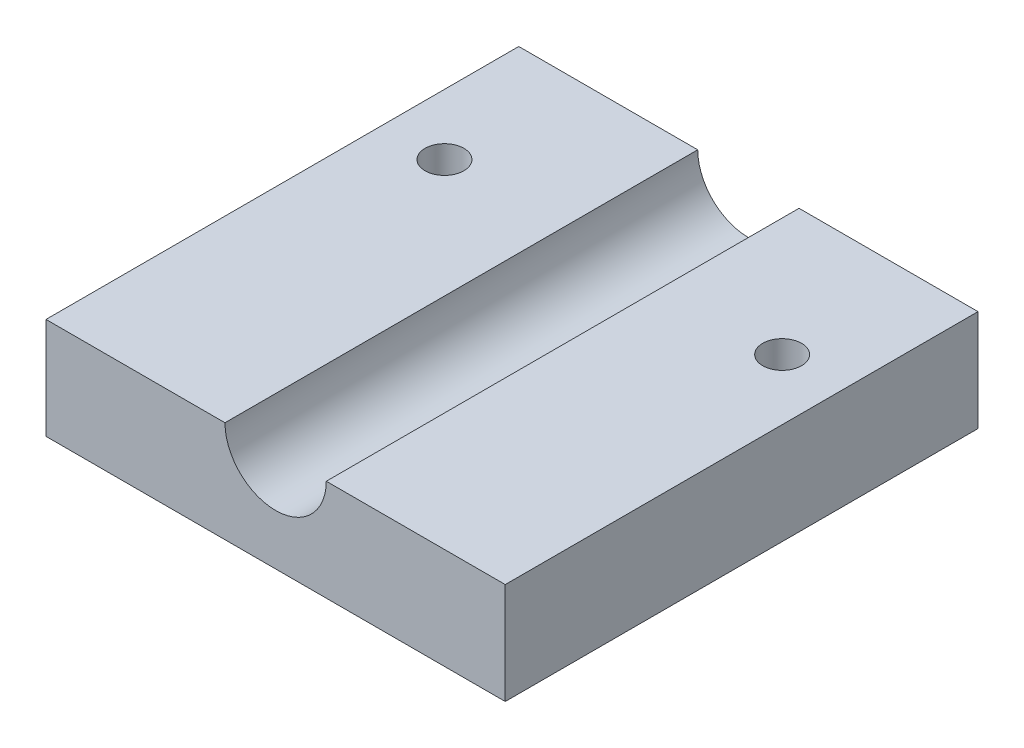
ISO-10303-21;
HEADER;
FILE_DESCRIPTION(('STEP AP214'),'2;1');
FILE_NAME('part.step','',(''),(''),'','','');
FILE_SCHEMA(('AUTOMOTIVE_DESIGN { 1 0 10303 214 1 1 1 1 }'));
ENDSEC;
DATA;
#1=APPLICATION_CONTEXT('core data for automotive mechanical design processes');
#2=APPLICATION_PROTOCOL_DEFINITION('international standard','automotive_design',2000,#1);
#3=PRODUCT_CONTEXT('',#1,'mechanical');
#4=PRODUCT('Part','Part','',(#3));
#5=PRODUCT_RELATED_PRODUCT_CATEGORY('part','',(#4));
#6=PRODUCT_DEFINITION_FORMATION('','',#4);
#7=PRODUCT_DEFINITION_CONTEXT('part definition',#1,'design');
#8=PRODUCT_DEFINITION('design','',#6,#7);
#9=PRODUCT_DEFINITION_SHAPE('','',#8);
#10=(LENGTH_UNIT() NAMED_UNIT(*) SI_UNIT(.MILLI.,.METRE.));
#11=(NAMED_UNIT(*) PLANE_ANGLE_UNIT() SI_UNIT($,.RADIAN.));
#12=(NAMED_UNIT(*) SI_UNIT($,.STERADIAN.) SOLID_ANGLE_UNIT());
#13=UNCERTAINTY_MEASURE_WITH_UNIT(LENGTH_MEASURE(1.E-05),#10,'distance_accuracy_value','');
#14=(GEOMETRIC_REPRESENTATION_CONTEXT(3) GLOBAL_UNCERTAINTY_ASSIGNED_CONTEXT((#13)) GLOBAL_UNIT_ASSIGNED_CONTEXT((#10,
#11,#12)) REPRESENTATION_CONTEXT('',''));
#15=CARTESIAN_POINT('',(0.,0.,0.));
#16=DIRECTION('',(0.,0.,1.));
#17=DIRECTION('',(1.,0.,0.));
#18=AXIS2_PLACEMENT_3D('',#15,#16,#17);
#19=CARTESIAN_POINT('',(0.,9.525,0.));
#20=DIRECTION('',(0.,-1.,0.));
#21=DIRECTION('',(0.,0.,-1.));
#22=AXIS2_PLACEMENT_3D('',#19,#20,#21);
#23=PLANE('',#22);
#24=CARTESIAN_POINT('',(15.875,9.525,-9.525));
#25=DIRECTION('',(0.,-1.,0.));
#26=DIRECTION('',(0.,0.,-1.));
#27=AXIS2_PLACEMENT_3D('',#24,#25,#26);
#28=CIRCLE('',#27,1.8288);
#29=CARTESIAN_POINT('',(15.875,9.525,-11.3538));
#30=VERTEX_POINT('',#29);
#31=EDGE_CURVE('E274',#30,#30,#28,.T.);
#32=ORIENTED_EDGE('',*,*,#31,.T.);
#33=EDGE_LOOP('',(#32));
#34=FACE_BOUND('',#33,.T.);
#35=DIRECTION('',(-1.,0.,0.));
#36=VECTOR('',#35,1.);
#37=CARTESIAN_POINT('',(-21.59,9.525,-22.225));
#38=LINE('',#37,#36);
#39=CARTESIAN_POINT('',(21.59,9.525,-22.225));
#40=VERTEX_POINT('',#39);
#41=CARTESIAN_POINT('',(4.76250000000001,9.525,-22.225));
#42=VERTEX_POINT('',#41);
#43=EDGE_CURVE('E88',#40,#42,#38,.T.);
#44=ORIENTED_EDGE('',*,*,#43,.T.);
#45=DIRECTION('',(0.,0.,1.));
#46=VECTOR('',#45,1.);
#47=CARTESIAN_POINT('',(4.76250000000001,9.525,-22.225));
#48=LINE('',#47,#46);
#49=CARTESIAN_POINT('',(4.76250000000001,9.525,22.225));
#50=VERTEX_POINT('',#49);
#51=EDGE_CURVE('E11',#42,#50,#48,.T.);
#52=ORIENTED_EDGE('',*,*,#51,.T.);
#53=DIRECTION('',(1.,0.,0.));
#54=VECTOR('',#53,1.);
#55=CARTESIAN_POINT('',(-21.59,9.525,22.225));
#56=LINE('',#55,#54);
#57=CARTESIAN_POINT('',(21.59,9.525,22.225));
#58=VERTEX_POINT('',#57);
#59=EDGE_CURVE('E59',#50,#58,#56,.T.);
#60=ORIENTED_EDGE('',*,*,#59,.T.);
#61=DIRECTION('',(0.,0.,-1.));
#62=VECTOR('',#61,1.);
#63=CARTESIAN_POINT('',(21.59,9.525,22.225));
#64=LINE('',#63,#62);
#65=EDGE_CURVE('E148',#58,#40,#64,.T.);
#66=ORIENTED_EDGE('',*,*,#65,.T.);
#67=EDGE_LOOP('',(#44,#52,#60,#66));
#68=FACE_BOUND('',#67,.T.);
#69=ADVANCED_FACE('F36',(#34,#68),#23,.F.);
#70=CARTESIAN_POINT('',(21.59,9.525,22.225));
#71=DIRECTION('',(-1.,0.,0.));
#72=DIRECTION('',(0.,0.,1.));
#73=AXIS2_PLACEMENT_3D('',#70,#71,#72);
#74=PLANE('',#73);
#75=DIRECTION('',(0.,0.,-1.));
#76=VECTOR('',#75,1.);
#77=CARTESIAN_POINT('',(21.59,0.,22.225));
#78=LINE('',#77,#76);
#79=CARTESIAN_POINT('',(21.59,0.,22.225));
#80=VERTEX_POINT('',#79);
#81=CARTESIAN_POINT('',(21.59,0.,-22.225));
#82=VERTEX_POINT('',#81);
#83=EDGE_CURVE('E146',#80,#82,#78,.T.);
#84=ORIENTED_EDGE('',*,*,#83,.T.);
#85=DIRECTION('',(0.,-1.,0.));
#86=VECTOR('',#85,1.);
#87=CARTESIAN_POINT('',(21.59,9.525,-22.225));
#88=LINE('',#87,#86);
#89=EDGE_CURVE('E171',#40,#82,#88,.T.);
#90=ORIENTED_EDGE('',*,*,#89,.F.);
#91=ORIENTED_EDGE('',*,*,#65,.F.);
#92=DIRECTION('',(0.,-1.,0.));
#93=VECTOR('',#92,1.);
#94=CARTESIAN_POINT('',(21.59,9.525,22.225));
#95=LINE('',#94,#93);
#96=EDGE_CURVE('E157',#58,#80,#95,.T.);
#97=ORIENTED_EDGE('',*,*,#96,.T.);
#98=EDGE_LOOP('',(#84,#90,#91,#97));
#99=FACE_BOUND('',#98,.T.);
#100=ADVANCED_FACE('F38',(#99),#74,.F.);
#101=CARTESIAN_POINT('',(-21.59,9.525,-22.225));
#102=DIRECTION('',(0.,0.,1.));
#103=DIRECTION('',(1.,0.,0.));
#104=AXIS2_PLACEMENT_3D('',#101,#102,#103);
#105=PLANE('',#104);
#106=CARTESIAN_POINT('',(-4.76249999999999,9.525,-22.225));
#107=VERTEX_POINT('',#106);
#108=CARTESIAN_POINT('',(-21.59,9.525,-22.225));
#109=VERTEX_POINT('',#108);
#110=EDGE_CURVE('E150',#107,#109,#38,.T.);
#111=ORIENTED_EDGE('',*,*,#110,.F.);
#112=CARTESIAN_POINT('',(0.,9.525,-22.225));
#113=DIRECTION('',(0.,0.,1.));
#114=DIRECTION('',(1.,0.,0.));
#115=AXIS2_PLACEMENT_3D('',#112,#113,#114);
#116=CIRCLE('',#115,4.7625);
#117=EDGE_CURVE('E51',#107,#42,#116,.T.);
#118=ORIENTED_EDGE('',*,*,#117,.T.);
#119=ORIENTED_EDGE('',*,*,#43,.F.);
#120=ORIENTED_EDGE('',*,*,#89,.T.);
#121=DIRECTION('',(-1.,0.,0.));
#122=VECTOR('',#121,1.);
#123=CARTESIAN_POINT('',(-21.59,0.,-22.225));
#124=LINE('',#123,#122);
#125=CARTESIAN_POINT('',(-21.59,0.,-22.225));
#126=VERTEX_POINT('',#125);
#127=EDGE_CURVE('E160',#82,#126,#124,.T.);
#128=ORIENTED_EDGE('',*,*,#127,.T.);
#129=DIRECTION('',(0.,-1.,0.));
#130=VECTOR('',#129,1.);
#131=CARTESIAN_POINT('',(-21.59,9.525,-22.225));
#132=LINE('',#131,#130);
#133=EDGE_CURVE('E168',#109,#126,#132,.T.);
#134=ORIENTED_EDGE('',*,*,#133,.F.);
#135=EDGE_LOOP('',(#111,#118,#119,#120,#128,#134));
#136=FACE_BOUND('',#135,.T.);
#137=ADVANCED_FACE('F178',(#136),#105,.F.);
#138=CARTESIAN_POINT('',(-21.59,9.525,22.225));
#139=DIRECTION('',(1.,0.,0.));
#140=DIRECTION('',(0.,0.,-1.));
#141=AXIS2_PLACEMENT_3D('',#138,#139,#140);
#142=PLANE('',#141);
#143=DIRECTION('',(0.,0.,1.));
#144=VECTOR('',#143,1.);
#145=CARTESIAN_POINT('',(-21.59,0.,22.225));
#146=LINE('',#145,#144);
#147=CARTESIAN_POINT('',(-21.59,0.,22.225));
#148=VERTEX_POINT('',#147);
#149=EDGE_CURVE('E162',#126,#148,#146,.T.);
#150=ORIENTED_EDGE('',*,*,#149,.T.);
#151=DIRECTION('',(0.,-1.,0.));
#152=VECTOR('',#151,1.);
#153=CARTESIAN_POINT('',(-21.59,9.525,22.225));
#154=LINE('',#153,#152);
#155=CARTESIAN_POINT('',(-21.59,9.525,22.225));
#156=VERTEX_POINT('',#155);
#157=EDGE_CURVE('E166',#156,#148,#154,.T.);
#158=ORIENTED_EDGE('',*,*,#157,.F.);
#159=DIRECTION('',(0.,0.,1.));
#160=VECTOR('',#159,1.);
#161=CARTESIAN_POINT('',(-21.59,9.525,22.225));
#162=LINE('',#161,#160);
#163=EDGE_CURVE('E152',#109,#156,#162,.T.);
#164=ORIENTED_EDGE('',*,*,#163,.F.);
#165=ORIENTED_EDGE('',*,*,#133,.T.);
#166=EDGE_LOOP('',(#150,#158,#164,#165));
#167=FACE_BOUND('',#166,.T.);
#168=ADVANCED_FACE('F183',(#167),#142,.F.);
#169=CARTESIAN_POINT('',(-21.59,9.525,22.225));
#170=DIRECTION('',(0.,0.,-1.));
#171=DIRECTION('',(-1.,0.,0.));
#172=AXIS2_PLACEMENT_3D('',#169,#170,#171);
#173=PLANE('',#172);
#174=ORIENTED_EDGE('',*,*,#59,.F.);
#175=CARTESIAN_POINT('',(0.,9.525,22.225));
#176=DIRECTION('',(0.,0.,1.));
#177=DIRECTION('',(1.,0.,0.));
#178=AXIS2_PLACEMENT_3D('',#175,#176,#177);
#179=CIRCLE('',#178,4.7625);
#180=CARTESIAN_POINT('',(-4.76249999999999,9.525,22.225));
#181=VERTEX_POINT('',#180);
#182=EDGE_CURVE('E144',#181,#50,#179,.T.);
#183=ORIENTED_EDGE('',*,*,#182,.F.);
#184=EDGE_CURVE('E154',#156,#181,#56,.T.);
#185=ORIENTED_EDGE('',*,*,#184,.F.);
#186=ORIENTED_EDGE('',*,*,#157,.T.);
#187=DIRECTION('',(1.,0.,0.));
#188=VECTOR('',#187,1.);
#189=CARTESIAN_POINT('',(-21.59,0.,22.225));
#190=LINE('',#189,#188);
#191=EDGE_CURVE('E81',#148,#80,#190,.T.);
#192=ORIENTED_EDGE('',*,*,#191,.T.);
#193=ORIENTED_EDGE('',*,*,#96,.F.);
#194=EDGE_LOOP('',(#174,#183,#185,#186,#192,#193));
#195=FACE_BOUND('',#194,.T.);
#196=ADVANCED_FACE('F184',(#195),#173,.F.);
#197=CARTESIAN_POINT('',(-15.875,9.525,-9.525));
#198=DIRECTION('',(0.,-1.,0.));
#199=DIRECTION('',(0.,0.,-1.));
#200=AXIS2_PLACEMENT_3D('',#197,#198,#199);
#201=CIRCLE('',#200,1.8288);
#202=CARTESIAN_POINT('',(-15.875,9.525,-11.3538));
#203=VERTEX_POINT('',#202);
#204=EDGE_CURVE('E126',#203,#203,#201,.T.);
#205=ORIENTED_EDGE('',*,*,#204,.T.);
#206=EDGE_LOOP('',(#205));
#207=FACE_BOUND('',#206,.T.);
#208=ORIENTED_EDGE('',*,*,#184,.T.);
#209=DIRECTION('',(0.,0.,1.));
#210=VECTOR('',#209,1.);
#211=CARTESIAN_POINT('',(-4.76249999999999,9.525,-22.225));
#212=LINE('',#211,#210);
#213=EDGE_CURVE('E44',#181,#107,#212,.F.);
#214=ORIENTED_EDGE('',*,*,#213,.T.);
#215=ORIENTED_EDGE('',*,*,#110,.T.);
#216=ORIENTED_EDGE('',*,*,#163,.T.);
#217=EDGE_LOOP('',(#208,#214,#215,#216));
#218=FACE_BOUND('',#217,.T.);
#219=ADVANCED_FACE('F174',(#207,#218),#23,.F.);
#220=CARTESIAN_POINT('',(0.,0.,0.));
#221=DIRECTION('',(0.,-1.,0.));
#222=DIRECTION('',(0.,0.,-1.));
#223=AXIS2_PLACEMENT_3D('',#220,#221,#222);
#224=PLANE('',#223);
#225=CARTESIAN_POINT('',(15.875,0.,-9.525));
#226=DIRECTION('',(0.,-1.,0.));
#227=DIRECTION('',(0.,0.,-1.));
#228=AXIS2_PLACEMENT_3D('',#225,#226,#227);
#229=CIRCLE('',#228,3.57250999999999);
#230=CARTESIAN_POINT('',(15.875,0.,-13.09751));
#231=VERTEX_POINT('',#230);
#232=EDGE_CURVE('E267',#231,#231,#229,.T.);
#233=ORIENTED_EDGE('',*,*,#232,.F.);
#234=EDGE_LOOP('',(#233));
#235=FACE_BOUND('',#234,.T.);
#236=CARTESIAN_POINT('',(-15.875,0.,-9.525));
#237=DIRECTION('',(0.,-1.,0.));
#238=DIRECTION('',(0.,0.,-1.));
#239=AXIS2_PLACEMENT_3D('',#236,#237,#238);
#240=CIRCLE('',#239,3.57250999999999);
#241=CARTESIAN_POINT('',(-15.875,0.,-13.09751));
#242=VERTEX_POINT('',#241);
#243=EDGE_CURVE('E276',#242,#242,#240,.T.);
#244=ORIENTED_EDGE('',*,*,#243,.F.);
#245=EDGE_LOOP('',(#244));
#246=FACE_BOUND('',#245,.T.);
#247=CARTESIAN_POINT('',(5.715,0.,19.05));
#248=DIRECTION('',(0.,-1.,0.));
#249=DIRECTION('',(0.,0.,-1.));
#250=AXIS2_PLACEMENT_3D('',#247,#248,#249);
#251=CIRCLE('',#250,1.13029999999999);
#252=CARTESIAN_POINT('',(5.715,0.,17.9197));
#253=VERTEX_POINT('',#252);
#254=EDGE_CURVE('E120',#253,#253,#251,.T.);
#255=ORIENTED_EDGE('',*,*,#254,.F.);
#256=EDGE_LOOP('',(#255));
#257=FACE_BOUND('',#256,.T.);
#258=CARTESIAN_POINT('',(-5.715,0.,19.05));
#259=DIRECTION('',(0.,-1.,0.));
#260=DIRECTION('',(0.,0.,-1.));
#261=AXIS2_PLACEMENT_3D('',#258,#259,#260);
#262=CIRCLE('',#261,1.13029999999999);
#263=CARTESIAN_POINT('',(-5.715,0.,17.9197));
#264=VERTEX_POINT('',#263);
#265=EDGE_CURVE('E119',#264,#264,#262,.T.);
#266=ORIENTED_EDGE('',*,*,#265,.F.);
#267=EDGE_LOOP('',(#266));
#268=FACE_BOUND('',#267,.T.);
#269=CARTESIAN_POINT('',(-13.081,0.,-19.9644));
#270=DIRECTION('',(0.,-1.,0.));
#271=DIRECTION('',(0.,0.,-1.));
#272=AXIS2_PLACEMENT_3D('',#269,#270,#271);
#273=CIRCLE('',#272,1.13029999999999);
#274=CARTESIAN_POINT('',(-13.081,0.,-21.0947));
#275=VERTEX_POINT('',#274);
#276=EDGE_CURVE('E132',#275,#275,#273,.T.);
#277=ORIENTED_EDGE('',*,*,#276,.F.);
#278=EDGE_LOOP('',(#277));
#279=FACE_BOUND('',#278,.T.);
#280=CARTESIAN_POINT('',(13.081,0.,-19.9644));
#281=DIRECTION('',(0.,-1.,0.));
#282=DIRECTION('',(0.,0.,-1.));
#283=AXIS2_PLACEMENT_3D('',#280,#281,#282);
#284=CIRCLE('',#283,1.13029999999999);
#285=CARTESIAN_POINT('',(13.081,0.,-21.0947));
#286=VERTEX_POINT('',#285);
#287=EDGE_CURVE('E138',#286,#286,#284,.T.);
#288=ORIENTED_EDGE('',*,*,#287,.F.);
#289=EDGE_LOOP('',(#288));
#290=FACE_BOUND('',#289,.T.);
#291=ORIENTED_EDGE('',*,*,#83,.F.);
#292=ORIENTED_EDGE('',*,*,#191,.F.);
#293=ORIENTED_EDGE('',*,*,#149,.F.);
#294=ORIENTED_EDGE('',*,*,#127,.F.);
#295=EDGE_LOOP('',(#291,#292,#293,#294));
#296=FACE_BOUND('',#295,.T.);
#297=ADVANCED_FACE('F191',(#235,#246,#257,#268,#279,#290,#296),#224,.T.);
#298=CARTESIAN_POINT('',(0.,9.525,-22.225));
#299=DIRECTION('',(0.,0.,1.));
#300=DIRECTION('',(1.,0.,0.));
#301=AXIS2_PLACEMENT_3D('',#298,#299,#300);
#302=CYLINDRICAL_SURFACE('',#301,4.7625);
#303=ORIENTED_EDGE('',*,*,#117,.F.);
#304=ORIENTED_EDGE('',*,*,#213,.F.);
#305=ORIENTED_EDGE('',*,*,#182,.T.);
#306=ORIENTED_EDGE('',*,*,#51,.F.);
#307=EDGE_LOOP('',(#303,#304,#305,#306));
#308=FACE_BOUND('',#307,.T.);
#309=ADVANCED_FACE('F185',(#308),#302,.F.);
#310=CARTESIAN_POINT('',(13.081,6.35,-19.9644));
#311=DIRECTION('',(0.,-1.,0.));
#312=DIRECTION('',(0.,0.,-1.));
#313=AXIS2_PLACEMENT_3D('',#310,#311,#312);
#314=CONICAL_SURFACE('',#313,1.1303,1.02974425867665);
#315=CARTESIAN_POINT('',(13.081,7.02915275768685,-19.9644));
#316=VERTEX_POINT('',#315);
#317=VERTEX_LOOP('',#316);
#318=FACE_BOUND('',#317,.T.);
#319=CARTESIAN_POINT('',(13.081,6.35,-19.9644));
#320=DIRECTION('',(0.,-1.,0.));
#321=DIRECTION('',(0.,0.,-1.));
#322=AXIS2_PLACEMENT_3D('',#319,#320,#321);
#323=CIRCLE('',#322,1.1303);
#324=CARTESIAN_POINT('',(13.081,6.35,-21.0947));
#325=VERTEX_POINT('',#324);
#326=EDGE_CURVE('E141',#325,#325,#323,.T.);
#327=ORIENTED_EDGE('',*,*,#326,.T.);
#328=EDGE_LOOP('',(#327));
#329=FACE_BOUND('',#328,.T.);
#330=ADVANCED_FACE('F199',(#318,#329),#314,.F.);
#331=CARTESIAN_POINT('',(13.081,0.,-19.9644));
#332=DIRECTION('',(0.,-1.,0.));
#333=DIRECTION('',(0.,0.,-1.));
#334=AXIS2_PLACEMENT_3D('',#331,#332,#333);
#335=CYLINDRICAL_SURFACE('',#334,1.13029999999999);
#336=ORIENTED_EDGE('',*,*,#326,.F.);
#337=EDGE_LOOP('',(#336));
#338=FACE_BOUND('',#337,.T.);
#339=ORIENTED_EDGE('',*,*,#287,.T.);
#340=EDGE_LOOP('',(#339));
#341=FACE_BOUND('',#340,.T.);
#342=ADVANCED_FACE('F215',(#338,#341),#335,.F.);
#343=CARTESIAN_POINT('',(-13.081,6.35,-19.9644));
#344=DIRECTION('',(0.,-1.,0.));
#345=DIRECTION('',(0.,0.,-1.));
#346=AXIS2_PLACEMENT_3D('',#343,#344,#345);
#347=CONICAL_SURFACE('',#346,1.1303,1.02974425867665);
#348=CARTESIAN_POINT('',(-13.081,7.02915275768685,-19.9644));
#349=VERTEX_POINT('',#348);
#350=VERTEX_LOOP('',#349);
#351=FACE_BOUND('',#350,.T.);
#352=CARTESIAN_POINT('',(-13.081,6.35,-19.9644));
#353=DIRECTION('',(0.,-1.,0.));
#354=DIRECTION('',(0.,0.,-1.));
#355=AXIS2_PLACEMENT_3D('',#352,#353,#354);
#356=CIRCLE('',#355,1.1303);
#357=CARTESIAN_POINT('',(-13.081,6.35,-21.0947));
#358=VERTEX_POINT('',#357);
#359=EDGE_CURVE('E135',#358,#358,#356,.T.);
#360=ORIENTED_EDGE('',*,*,#359,.T.);
#361=EDGE_LOOP('',(#360));
#362=FACE_BOUND('',#361,.T.);
#363=ADVANCED_FACE('F219',(#351,#362),#347,.F.);
#364=CARTESIAN_POINT('',(-13.081,0.,-19.9644));
#365=DIRECTION('',(0.,-1.,0.));
#366=DIRECTION('',(0.,0.,-1.));
#367=AXIS2_PLACEMENT_3D('',#364,#365,#366);
#368=CYLINDRICAL_SURFACE('',#367,1.13029999999999);
#369=ORIENTED_EDGE('',*,*,#359,.F.);
#370=EDGE_LOOP('',(#369));
#371=FACE_BOUND('',#370,.T.);
#372=ORIENTED_EDGE('',*,*,#276,.T.);
#373=EDGE_LOOP('',(#372));
#374=FACE_BOUND('',#373,.T.);
#375=ADVANCED_FACE('F223',(#371,#374),#368,.F.);
#376=CARTESIAN_POINT('',(-5.715,6.35,19.05));
#377=DIRECTION('',(0.,-1.,0.));
#378=DIRECTION('',(0.,0.,-1.));
#379=AXIS2_PLACEMENT_3D('',#376,#377,#378);
#380=CONICAL_SURFACE('',#379,1.1303,1.02974425867665);
#381=CARTESIAN_POINT('',(-5.715,7.02915275768685,19.05));
#382=VERTEX_POINT('',#381);
#383=VERTEX_LOOP('',#382);
#384=FACE_BOUND('',#383,.T.);
#385=CARTESIAN_POINT('',(-5.715,6.35,19.05));
#386=DIRECTION('',(0.,-1.,0.));
#387=DIRECTION('',(0.,0.,-1.));
#388=AXIS2_PLACEMENT_3D('',#385,#386,#387);
#389=CIRCLE('',#388,1.1303);
#390=CARTESIAN_POINT('',(-5.715,6.35,17.9197));
#391=VERTEX_POINT('',#390);
#392=EDGE_CURVE('E123',#391,#391,#389,.T.);
#393=ORIENTED_EDGE('',*,*,#392,.T.);
#394=EDGE_LOOP('',(#393));
#395=FACE_BOUND('',#394,.T.);
#396=ADVANCED_FACE('F227',(#384,#395),#380,.F.);
#397=CARTESIAN_POINT('',(-5.715,0.,19.05));
#398=DIRECTION('',(0.,-1.,0.));
#399=DIRECTION('',(0.,0.,-1.));
#400=AXIS2_PLACEMENT_3D('',#397,#398,#399);
#401=CYLINDRICAL_SURFACE('',#400,1.13029999999999);
#402=ORIENTED_EDGE('',*,*,#392,.F.);
#403=EDGE_LOOP('',(#402));
#404=FACE_BOUND('',#403,.T.);
#405=ORIENTED_EDGE('',*,*,#265,.T.);
#406=EDGE_LOOP('',(#405));
#407=FACE_BOUND('',#406,.T.);
#408=ADVANCED_FACE('F113',(#404,#407),#401,.F.);
#409=CARTESIAN_POINT('',(5.715,6.35,19.05));
#410=DIRECTION('',(0.,-1.,0.));
#411=DIRECTION('',(0.,0.,-1.));
#412=AXIS2_PLACEMENT_3D('',#409,#410,#411);
#413=CONICAL_SURFACE('',#412,1.1303,1.02974425867665);
#414=CARTESIAN_POINT('',(5.715,7.02915275768685,19.05));
#415=VERTEX_POINT('',#414);
#416=VERTEX_LOOP('',#415);
#417=FACE_BOUND('',#416,.T.);
#418=CARTESIAN_POINT('',(5.715,6.35,19.05));
#419=DIRECTION('',(0.,-1.,0.));
#420=DIRECTION('',(0.,0.,-1.));
#421=AXIS2_PLACEMENT_3D('',#418,#419,#420);
#422=CIRCLE('',#421,1.1303);
#423=CARTESIAN_POINT('',(5.715,6.35,17.9197));
#424=VERTEX_POINT('',#423);
#425=EDGE_CURVE('E117',#424,#424,#422,.T.);
#426=ORIENTED_EDGE('',*,*,#425,.T.);
#427=EDGE_LOOP('',(#426));
#428=FACE_BOUND('',#427,.T.);
#429=ADVANCED_FACE('F109',(#417,#428),#413,.F.);
#430=CARTESIAN_POINT('',(5.715,0.,19.05));
#431=DIRECTION('',(0.,-1.,0.));
#432=DIRECTION('',(0.,0.,-1.));
#433=AXIS2_PLACEMENT_3D('',#430,#431,#432);
#434=CYLINDRICAL_SURFACE('',#433,1.13029999999999);
#435=ORIENTED_EDGE('',*,*,#425,.F.);
#436=EDGE_LOOP('',(#435));
#437=FACE_BOUND('',#436,.T.);
#438=ORIENTED_EDGE('',*,*,#254,.T.);
#439=EDGE_LOOP('',(#438));
#440=FACE_BOUND('',#439,.T.);
#441=ADVANCED_FACE('F112',(#437,#440),#434,.F.);
#442=CARTESIAN_POINT('',(-15.875,0.,-9.525));
#443=DIRECTION('',(0.,-1.,0.));
#444=DIRECTION('',(0.,0.,-1.));
#445=AXIS2_PLACEMENT_3D('',#442,#443,#444);
#446=CYLINDRICAL_SURFACE('',#445,1.8288);
#447=ORIENTED_EDGE('',*,*,#204,.F.);
#448=EDGE_LOOP('',(#447));
#449=FACE_BOUND('',#448,.T.);
#450=CARTESIAN_POINT('',(-15.875,3.5052,-9.525));
#451=DIRECTION('',(0.,-1.,0.));
#452=DIRECTION('',(0.,0.,-1.));
#453=AXIS2_PLACEMENT_3D('',#450,#451,#452);
#454=CIRCLE('',#453,1.8288);
#455=CARTESIAN_POINT('',(-15.875,3.5052,-11.3538));
#456=VERTEX_POINT('',#455);
#457=EDGE_CURVE('E282',#456,#456,#454,.T.);
#458=ORIENTED_EDGE('',*,*,#457,.T.);
#459=EDGE_LOOP('',(#458));
#460=FACE_BOUND('',#459,.T.);
#461=ADVANCED_FACE('F237',(#449,#460),#446,.F.);
#462=CARTESIAN_POINT('',(-14.0462,3.5052,-9.525));
#463=DIRECTION('',(0.,1.,0.));
#464=DIRECTION('',(0.,0.,1.));
#465=AXIS2_PLACEMENT_3D('',#462,#463,#464);
#466=PLANE('',#465);
#467=ORIENTED_EDGE('',*,*,#457,.F.);
#468=EDGE_LOOP('',(#467));
#469=FACE_BOUND('',#468,.T.);
#470=CARTESIAN_POINT('',(-15.875,3.5052,-9.525));
#471=DIRECTION('',(0.,-1.,0.));
#472=DIRECTION('',(0.,0.,-1.));
#473=AXIS2_PLACEMENT_3D('',#470,#471,#472);
#474=CIRCLE('',#473,3.57251);
#475=CARTESIAN_POINT('',(-15.875,3.5052,-13.09751));
#476=VERTEX_POINT('',#475);
#477=EDGE_CURVE('E279',#476,#476,#474,.T.);
#478=ORIENTED_EDGE('',*,*,#477,.T.);
#479=EDGE_LOOP('',(#478));
#480=FACE_BOUND('',#479,.T.);
#481=ADVANCED_FACE('F240',(#469,#480),#466,.F.);
#482=CARTESIAN_POINT('',(-15.875,0.,-9.525));
#483=DIRECTION('',(0.,-1.,0.));
#484=DIRECTION('',(0.,0.,-1.));
#485=AXIS2_PLACEMENT_3D('',#482,#483,#484);
#486=CYLINDRICAL_SURFACE('',#485,3.57250999999999);
#487=ORIENTED_EDGE('',*,*,#477,.F.);
#488=EDGE_LOOP('',(#487));
#489=FACE_BOUND('',#488,.T.);
#490=ORIENTED_EDGE('',*,*,#243,.T.);
#491=EDGE_LOOP('',(#490));
#492=FACE_BOUND('',#491,.T.);
#493=ADVANCED_FACE('F244',(#489,#492),#486,.F.);
#494=CARTESIAN_POINT('',(15.875,0.,-9.525));
#495=DIRECTION('',(0.,-1.,0.));
#496=DIRECTION('',(0.,0.,-1.));
#497=AXIS2_PLACEMENT_3D('',#494,#495,#496);
#498=CYLINDRICAL_SURFACE('',#497,1.8288);
#499=ORIENTED_EDGE('',*,*,#31,.F.);
#500=EDGE_LOOP('',(#499));
#501=FACE_BOUND('',#500,.T.);
#502=CARTESIAN_POINT('',(15.875,3.5052,-9.525));
#503=DIRECTION('',(0.,-1.,0.));
#504=DIRECTION('',(0.,0.,-1.));
#505=AXIS2_PLACEMENT_3D('',#502,#503,#504);
#506=CIRCLE('',#505,1.8288);
#507=CARTESIAN_POINT('',(15.875,3.5052,-11.3538));
#508=VERTEX_POINT('',#507);
#509=EDGE_CURVE('E269',#508,#508,#506,.T.);
#510=ORIENTED_EDGE('',*,*,#509,.T.);
#511=EDGE_LOOP('',(#510));
#512=FACE_BOUND('',#511,.T.);
#513=ADVANCED_FACE('F248',(#501,#512),#498,.F.);
#514=CARTESIAN_POINT('',(17.7038,3.5052,-9.525));
#515=DIRECTION('',(0.,1.,0.));
#516=DIRECTION('',(0.,0.,1.));
#517=AXIS2_PLACEMENT_3D('',#514,#515,#516);
#518=PLANE('',#517);
#519=ORIENTED_EDGE('',*,*,#509,.F.);
#520=EDGE_LOOP('',(#519));
#521=FACE_BOUND('',#520,.T.);
#522=CARTESIAN_POINT('',(15.875,3.5052,-9.525));
#523=DIRECTION('',(0.,-1.,0.));
#524=DIRECTION('',(0.,0.,-1.));
#525=AXIS2_PLACEMENT_3D('',#522,#523,#524);
#526=CIRCLE('',#525,3.57250999999999);
#527=CARTESIAN_POINT('',(15.875,3.5052,-13.09751));
#528=VERTEX_POINT('',#527);
#529=EDGE_CURVE('E265',#528,#528,#526,.T.);
#530=ORIENTED_EDGE('',*,*,#529,.T.);
#531=EDGE_LOOP('',(#530));
#532=FACE_BOUND('',#531,.T.);
#533=ADVANCED_FACE('F252',(#521,#532),#518,.F.);
#534=CARTESIAN_POINT('',(15.875,0.,-9.525));
#535=DIRECTION('',(0.,-1.,0.));
#536=DIRECTION('',(0.,0.,-1.));
#537=AXIS2_PLACEMENT_3D('',#534,#535,#536);
#538=CYLINDRICAL_SURFACE('',#537,3.57250999999999);
#539=ORIENTED_EDGE('',*,*,#529,.F.);
#540=EDGE_LOOP('',(#539));
#541=FACE_BOUND('',#540,.T.);
#542=ORIENTED_EDGE('',*,*,#232,.T.);
#543=EDGE_LOOP('',(#542));
#544=FACE_BOUND('',#543,.T.);
#545=ADVANCED_FACE('F256',(#541,#544),#538,.F.);
#546=CLOSED_SHELL('',(#69,#100,#137,#168,#196,#219,#297,#309,#330,#342,#363,#375,#396,#408,#429,
#441,#461,#481,#493,#513,#533,#545));
#547=MANIFOLD_SOLID_BREP('B2',#546);
#548=ADVANCED_BREP_SHAPE_REPRESENTATION('',(#18,#547),#14);
#549=SHAPE_DEFINITION_REPRESENTATION(#9,#548);
ENDSEC;
END-ISO-10303-21;
